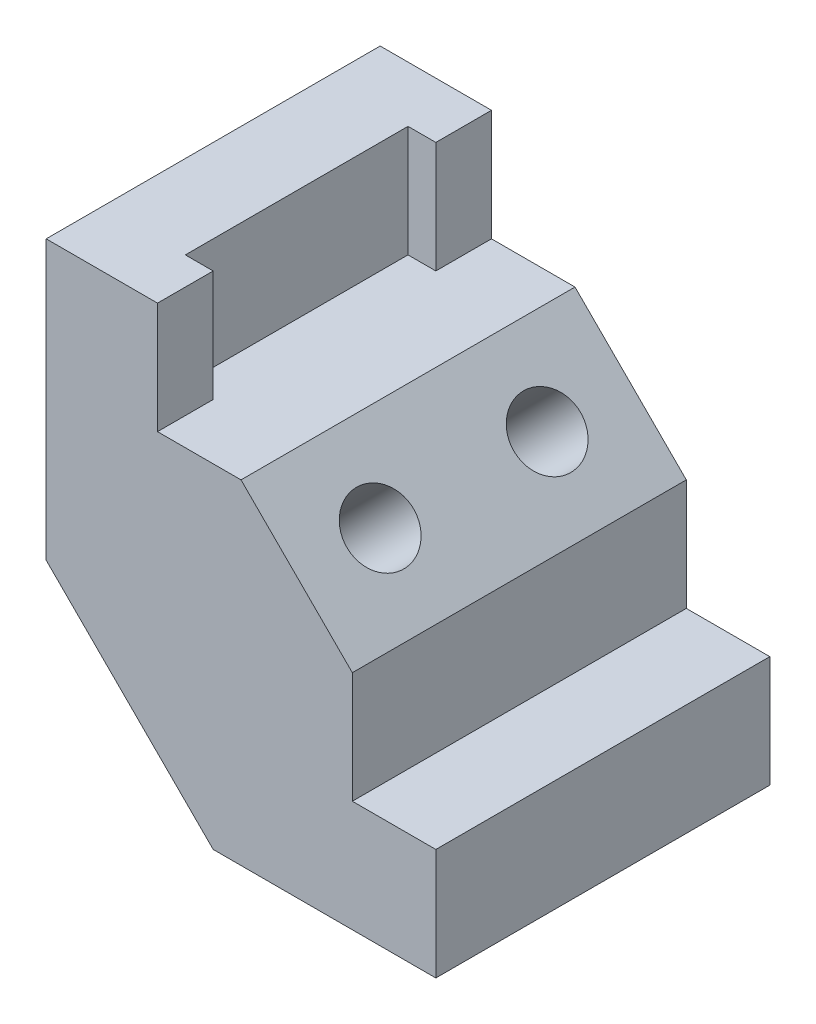
ISO-10303-21;
HEADER;
FILE_DESCRIPTION(('STEP AP214'),'2;1');
FILE_NAME('part.step','',(''),(''),'','','');
FILE_SCHEMA(('AUTOMOTIVE_DESIGN { 1 0 10303 214 1 1 1 1 }'));
ENDSEC;
DATA;
#1=APPLICATION_CONTEXT('core data for automotive mechanical design processes');
#2=APPLICATION_PROTOCOL_DEFINITION('international standard','automotive_design',2000,#1);
#3=PRODUCT_CONTEXT('',#1,'mechanical');
#4=PRODUCT('Part','Part','',(#3));
#5=PRODUCT_RELATED_PRODUCT_CATEGORY('part','',(#4));
#6=PRODUCT_DEFINITION_FORMATION('','',#4);
#7=PRODUCT_DEFINITION_CONTEXT('part definition',#1,'design');
#8=PRODUCT_DEFINITION('design','',#6,#7);
#9=PRODUCT_DEFINITION_SHAPE('','',#8);
#10=(LENGTH_UNIT() NAMED_UNIT(*) SI_UNIT(.MILLI.,.METRE.));
#11=(NAMED_UNIT(*) PLANE_ANGLE_UNIT() SI_UNIT($,.RADIAN.));
#12=(NAMED_UNIT(*) SI_UNIT($,.STERADIAN.) SOLID_ANGLE_UNIT());
#13=UNCERTAINTY_MEASURE_WITH_UNIT(LENGTH_MEASURE(1.E-05),#10,'distance_accuracy_value','');
#14=(GEOMETRIC_REPRESENTATION_CONTEXT(3) GLOBAL_UNCERTAINTY_ASSIGNED_CONTEXT((#13)) GLOBAL_UNIT_ASSIGNED_CONTEXT((#10,
#11,#12)) REPRESENTATION_CONTEXT('',''));
#15=CARTESIAN_POINT('',(0.,0.,0.));
#16=DIRECTION('',(0.,0.,1.));
#17=DIRECTION('',(1.,0.,0.));
#18=AXIS2_PLACEMENT_3D('',#15,#16,#17);
#19=CARTESIAN_POINT('',(25.4,-7.00371083234736,38.1));
#20=DIRECTION('',(-1.,0.,0.));
#21=DIRECTION('',(0.,0.,1.));
#22=AXIS2_PLACEMENT_3D('',#19,#20,#21);
#23=PLANE('',#22);
#24=DIRECTION('',(0.,0.,-1.));
#25=VECTOR('',#24,1.);
#26=CARTESIAN_POINT('',(25.4,-7.00371083234736,38.1));
#27=LINE('',#26,#25);
#28=CARTESIAN_POINT('',(25.4,-7.00371083234736,38.1));
#29=VERTEX_POINT('',#28);
#30=CARTESIAN_POINT('',(25.4,-7.00371083234735,25.4));
#31=VERTEX_POINT('',#30);
#32=EDGE_CURVE('E154',#29,#31,#27,.T.);
#33=ORIENTED_EDGE('',*,*,#32,.T.);
#34=DIRECTION('',(0.,1.,0.));
#35=VECTOR('',#34,1.);
#36=CARTESIAN_POINT('',(25.4,-58.1990475340431,25.4));
#37=LINE('',#36,#35);
#38=CARTESIAN_POINT('',(25.4,18.3962891676527,25.4));
#39=VERTEX_POINT('',#38);
#40=EDGE_CURVE('E236',#31,#39,#37,.T.);
#41=ORIENTED_EDGE('',*,*,#40,.T.);
#42=DIRECTION('',(0.,0.,-1.));
#43=VECTOR('',#42,1.);
#44=CARTESIAN_POINT('',(25.4,18.3962891676527,38.1));
#45=LINE('',#44,#43);
#46=CARTESIAN_POINT('',(25.4,18.3962891676527,38.1));
#47=VERTEX_POINT('',#46);
#48=EDGE_CURVE('E184',#47,#39,#45,.T.);
#49=ORIENTED_EDGE('',*,*,#48,.F.);
#50=DIRECTION('',(0.,1.,0.));
#51=VECTOR('',#50,1.);
#52=CARTESIAN_POINT('',(25.4,-7.00371083234736,38.1));
#53=LINE('',#52,#51);
#54=EDGE_CURVE('E63',#29,#47,#53,.T.);
#55=ORIENTED_EDGE('',*,*,#54,.F.);
#56=EDGE_LOOP('',(#33,#41,#49,#55));
#57=FACE_BOUND('',#56,.T.);
#58=ADVANCED_FACE('F39',(#57),#23,.F.);
#59=CARTESIAN_POINT('',(25.4,18.3962891676527,38.1));
#60=DIRECTION('',(0.,-1.,0.));
#61=DIRECTION('',(1.,0.,0.));
#62=AXIS2_PLACEMENT_3D('',#59,#60,#61);
#63=PLANE('',#62);
#64=ORIENTED_EDGE('',*,*,#48,.T.);
#65=DIRECTION('',(1.,0.,0.));
#66=VECTOR('',#65,1.);
#67=CARTESIAN_POINT('',(25.4,18.3962891676527,25.4));
#68=LINE('',#67,#66);
#69=CARTESIAN_POINT('',(19.05,18.3962891676527,25.4));
#70=VERTEX_POINT('',#69);
#71=EDGE_CURVE('E253',#70,#39,#68,.T.);
#72=ORIENTED_EDGE('',*,*,#71,.F.);
#73=DIRECTION('',(0.,0.,1.));
#74=VECTOR('',#73,1.);
#75=CARTESIAN_POINT('',(19.05,18.3962891676527,25.4));
#76=LINE('',#75,#74);
#77=CARTESIAN_POINT('',(19.05,18.3962891676527,-25.4));
#78=VERTEX_POINT('',#77);
#79=EDGE_CURVE('E250',#78,#70,#76,.T.);
#80=ORIENTED_EDGE('',*,*,#79,.F.);
#81=DIRECTION('',(-1.,0.,0.));
#82=VECTOR('',#81,1.);
#83=CARTESIAN_POINT('',(25.4,18.3962891676527,-25.4));
#84=LINE('',#83,#82);
#85=CARTESIAN_POINT('',(25.4,18.3962891676527,-25.4));
#86=VERTEX_POINT('',#85);
#87=EDGE_CURVE('E249',#86,#78,#84,.T.);
#88=ORIENTED_EDGE('',*,*,#87,.F.);
#89=CARTESIAN_POINT('',(25.4,18.3962891676527,-38.1));
#90=VERTEX_POINT('',#89);
#91=EDGE_CURVE('E103',#86,#90,#45,.T.);
#92=ORIENTED_EDGE('',*,*,#91,.T.);
#93=DIRECTION('',(-1.,0.,0.));
#94=VECTOR('',#93,1.);
#95=CARTESIAN_POINT('',(25.4,18.3962891676527,-38.1));
#96=LINE('',#95,#94);
#97=CARTESIAN_POINT('',(0.,18.3962891676526,-38.1));
#98=VERTEX_POINT('',#97);
#99=EDGE_CURVE('E163',#90,#98,#96,.T.);
#100=ORIENTED_EDGE('',*,*,#99,.T.);
#101=DIRECTION('',(0.,0.,-1.));
#102=VECTOR('',#101,1.);
#103=CARTESIAN_POINT('',(0.,18.3962891676526,38.1));
#104=LINE('',#103,#102);
#105=CARTESIAN_POINT('',(0.,18.3962891676526,38.1));
#106=VERTEX_POINT('',#105);
#107=EDGE_CURVE('E11',#106,#98,#104,.T.);
#108=ORIENTED_EDGE('',*,*,#107,.F.);
#109=DIRECTION('',(-1.,0.,0.));
#110=VECTOR('',#109,1.);
#111=CARTESIAN_POINT('',(25.4,18.3962891676527,38.1));
#112=LINE('',#111,#110);
#113=EDGE_CURVE('E183',#47,#106,#112,.T.);
#114=ORIENTED_EDGE('',*,*,#113,.F.);
#115=EDGE_LOOP('',(#64,#72,#80,#88,#92,#100,#108,#114));
#116=FACE_BOUND('',#115,.T.);
#117=ADVANCED_FACE('F41',(#116),#63,.F.);
#118=CARTESIAN_POINT('',(0.,18.3962891676526,38.1));
#119=DIRECTION('',(1.,0.,0.));
#120=DIRECTION('',(0.,0.,-1.));
#121=AXIS2_PLACEMENT_3D('',#118,#119,#120);
#122=PLANE('',#121);
#123=DIRECTION('',(0.,-1.,0.));
#124=VECTOR('',#123,1.);
#125=CARTESIAN_POINT('',(0.,18.3962891676526,-38.1));
#126=LINE('',#125,#124);
#127=CARTESIAN_POINT('',(0.,-45.1037108323472,-38.1));
#128=VERTEX_POINT('',#127);
#129=EDGE_CURVE('E165',#98,#128,#126,.T.);
#130=ORIENTED_EDGE('',*,*,#129,.T.);
#131=DIRECTION('',(0.,0.,-1.));
#132=VECTOR('',#131,1.);
#133=CARTESIAN_POINT('',(0.,-45.1037108323472,38.1));
#134=LINE('',#133,#132);
#135=CARTESIAN_POINT('',(0.,-45.1037108323472,38.1));
#136=VERTEX_POINT('',#135);
#137=EDGE_CURVE('E47',#136,#128,#134,.T.);
#138=ORIENTED_EDGE('',*,*,#137,.F.);
#139=DIRECTION('',(0.,-1.,0.));
#140=VECTOR('',#139,1.);
#141=CARTESIAN_POINT('',(0.,18.3962891676526,38.1));
#142=LINE('',#141,#140);
#143=EDGE_CURVE('E111',#106,#136,#142,.T.);
#144=ORIENTED_EDGE('',*,*,#143,.F.);
#145=ORIENTED_EDGE('',*,*,#107,.T.);
#146=EDGE_LOOP('',(#130,#138,#144,#145));
#147=FACE_BOUND('',#146,.T.);
#148=ADVANCED_FACE('F309',(#147),#122,.F.);
#149=CARTESIAN_POINT('',(0.,-45.1037108323472,38.1));
#150=DIRECTION('',(0.707106781186549,0.707106781186546,0.));
#151=DIRECTION('',(-0.707106781186546,0.707106781186549,0.));
#152=AXIS2_PLACEMENT_3D('',#149,#150,#151);
#153=PLANE('',#152);
#154=DIRECTION('',(0.707106781186546,-0.707106781186549,0.));
#155=VECTOR('',#154,1.);
#156=CARTESIAN_POINT('',(0.,-45.1037108323472,-38.1));
#157=LINE('',#156,#155);
#158=CARTESIAN_POINT('',(38.1,-83.2037108323474,-38.1));
#159=VERTEX_POINT('',#158);
#160=EDGE_CURVE('E168',#128,#159,#157,.T.);
#161=ORIENTED_EDGE('',*,*,#160,.T.);
#162=DIRECTION('',(0.,0.,-1.));
#163=VECTOR('',#162,1.);
#164=CARTESIAN_POINT('',(38.1,-83.2037108323474,38.1));
#165=LINE('',#164,#163);
#166=CARTESIAN_POINT('',(38.1,-83.2037108323474,38.1));
#167=VERTEX_POINT('',#166);
#168=EDGE_CURVE('E199',#167,#159,#165,.T.);
#169=ORIENTED_EDGE('',*,*,#168,.F.);
#170=DIRECTION('',(0.707106781186546,-0.707106781186549,0.));
#171=VECTOR('',#170,1.);
#172=CARTESIAN_POINT('',(0.,-45.1037108323472,38.1));
#173=LINE('',#172,#171);
#174=EDGE_CURVE('E207',#136,#167,#173,.T.);
#175=ORIENTED_EDGE('',*,*,#174,.F.);
#176=ORIENTED_EDGE('',*,*,#137,.T.);
#177=EDGE_LOOP('',(#161,#169,#175,#176));
#178=FACE_BOUND('',#177,.T.);
#179=ADVANCED_FACE('F205',(#178),#153,.F.);
#180=CARTESIAN_POINT('',(38.1,-83.2037108323474,38.1));
#181=DIRECTION('',(0.,1.,0.));
#182=DIRECTION('',(-1.,0.,0.));
#183=AXIS2_PLACEMENT_3D('',#180,#181,#182);
#184=PLANE('',#183);
#185=DIRECTION('',(1.,0.,0.));
#186=VECTOR('',#185,1.);
#187=CARTESIAN_POINT('',(38.1,-83.2037108323474,-38.1));
#188=LINE('',#187,#186);
#189=CARTESIAN_POINT('',(88.9,-83.2037108323474,-38.1));
#190=VERTEX_POINT('',#189);
#191=EDGE_CURVE('E170',#159,#190,#188,.T.);
#192=ORIENTED_EDGE('',*,*,#191,.T.);
#193=DIRECTION('',(0.,0.,-1.));
#194=VECTOR('',#193,1.);
#195=CARTESIAN_POINT('',(88.9,-83.2037108323474,38.1));
#196=LINE('',#195,#194);
#197=CARTESIAN_POINT('',(88.9,-83.2037108323474,38.1));
#198=VERTEX_POINT('',#197);
#199=EDGE_CURVE('E196',#198,#190,#196,.T.);
#200=ORIENTED_EDGE('',*,*,#199,.F.);
#201=DIRECTION('',(1.,0.,0.));
#202=VECTOR('',#201,1.);
#203=CARTESIAN_POINT('',(38.1,-83.2037108323474,38.1));
#204=LINE('',#203,#202);
#205=EDGE_CURVE('E225',#167,#198,#204,.T.);
#206=ORIENTED_EDGE('',*,*,#205,.F.);
#207=ORIENTED_EDGE('',*,*,#168,.T.);
#208=EDGE_LOOP('',(#192,#200,#206,#207));
#209=FACE_BOUND('',#208,.T.);
#210=ADVANCED_FACE('F216',(#209),#184,.F.);
#211=CARTESIAN_POINT('',(88.9,-83.2037108323474,38.1));
#212=DIRECTION('',(-1.,0.,0.));
#213=DIRECTION('',(0.,0.,1.));
#214=AXIS2_PLACEMENT_3D('',#211,#212,#213);
#215=PLANE('',#214);
#216=DIRECTION('',(0.,1.,0.));
#217=VECTOR('',#216,1.);
#218=CARTESIAN_POINT('',(88.9,-83.2037108323474,-38.1));
#219=LINE('',#218,#217);
#220=CARTESIAN_POINT('',(88.9,-57.8037108323474,-38.1));
#221=VERTEX_POINT('',#220);
#222=EDGE_CURVE('E172',#190,#221,#219,.T.);
#223=ORIENTED_EDGE('',*,*,#222,.T.);
#224=DIRECTION('',(0.,0.,-1.));
#225=VECTOR('',#224,1.);
#226=CARTESIAN_POINT('',(88.9,-57.8037108323474,38.1));
#227=LINE('',#226,#225);
#228=CARTESIAN_POINT('',(88.9,-57.8037108323474,38.1));
#229=VERTEX_POINT('',#228);
#230=EDGE_CURVE('E193',#229,#221,#227,.T.);
#231=ORIENTED_EDGE('',*,*,#230,.F.);
#232=DIRECTION('',(0.,1.,0.));
#233=VECTOR('',#232,1.);
#234=CARTESIAN_POINT('',(88.9,-83.2037108323474,38.1));
#235=LINE('',#234,#233);
#236=EDGE_CURVE('E222',#198,#229,#235,.T.);
#237=ORIENTED_EDGE('',*,*,#236,.F.);
#238=ORIENTED_EDGE('',*,*,#199,.T.);
#239=EDGE_LOOP('',(#223,#231,#237,#238));
#240=FACE_BOUND('',#239,.T.);
#241=ADVANCED_FACE('F220',(#240),#215,.F.);
#242=CARTESIAN_POINT('',(88.9,-57.8037108323474,38.1));
#243=DIRECTION('',(0.,-1.,0.));
#244=DIRECTION('',(1.,0.,0.));
#245=AXIS2_PLACEMENT_3D('',#242,#243,#244);
#246=PLANE('',#245);
#247=DIRECTION('',(-1.,0.,0.));
#248=VECTOR('',#247,1.);
#249=CARTESIAN_POINT('',(88.9,-57.8037108323474,-38.1));
#250=LINE('',#249,#248);
#251=CARTESIAN_POINT('',(69.8499999999999,-57.8037108323473,-38.1));
#252=VERTEX_POINT('',#251);
#253=EDGE_CURVE('E174',#221,#252,#250,.T.);
#254=ORIENTED_EDGE('',*,*,#253,.T.);
#255=DIRECTION('',(0.,0.,-1.));
#256=VECTOR('',#255,1.);
#257=CARTESIAN_POINT('',(69.8499999999999,-57.8037108323473,38.1));
#258=LINE('',#257,#256);
#259=CARTESIAN_POINT('',(69.8499999999999,-57.8037108323473,38.1));
#260=VERTEX_POINT('',#259);
#261=EDGE_CURVE('E190',#260,#252,#258,.T.);
#262=ORIENTED_EDGE('',*,*,#261,.F.);
#263=DIRECTION('',(-1.,0.,0.));
#264=VECTOR('',#263,1.);
#265=CARTESIAN_POINT('',(88.9,-57.8037108323474,38.1));
#266=LINE('',#265,#264);
#267=EDGE_CURVE('E224',#229,#260,#266,.T.);
#268=ORIENTED_EDGE('',*,*,#267,.F.);
#269=ORIENTED_EDGE('',*,*,#230,.T.);
#270=EDGE_LOOP('',(#254,#262,#268,#269));
#271=FACE_BOUND('',#270,.T.);
#272=ADVANCED_FACE('F352',(#271),#246,.F.);
#273=CARTESIAN_POINT('',(69.8499999999999,-57.8037108323473,38.1));
#274=DIRECTION('',(-1.,0.,0.));
#275=DIRECTION('',(0.,-1.,0.));
#276=AXIS2_PLACEMENT_3D('',#273,#274,#275);
#277=PLANE('',#276);
#278=DIRECTION('',(0.,1.,0.));
#279=VECTOR('',#278,1.);
#280=CARTESIAN_POINT('',(69.8499999999999,-57.8037108323473,-38.1));
#281=LINE('',#280,#279);
#282=CARTESIAN_POINT('',(69.8499999999999,-32.4037108323473,-38.1));
#283=VERTEX_POINT('',#282);
#284=EDGE_CURVE('E176',#252,#283,#281,.T.);
#285=ORIENTED_EDGE('',*,*,#284,.T.);
#286=DIRECTION('',(0.,0.,-1.));
#287=VECTOR('',#286,1.);
#288=CARTESIAN_POINT('',(69.8499999999999,-32.4037108323473,38.1));
#289=LINE('',#288,#287);
#290=CARTESIAN_POINT('',(69.8499999999999,-32.4037108323473,38.1));
#291=VERTEX_POINT('',#290);
#292=EDGE_CURVE('E153',#291,#283,#289,.T.);
#293=ORIENTED_EDGE('',*,*,#292,.F.);
#294=DIRECTION('',(0.,1.,0.));
#295=VECTOR('',#294,1.);
#296=CARTESIAN_POINT('',(69.8499999999999,-57.8037108323473,38.1));
#297=LINE('',#296,#295);
#298=EDGE_CURVE('E140',#260,#291,#297,.T.);
#299=ORIENTED_EDGE('',*,*,#298,.F.);
#300=ORIENTED_EDGE('',*,*,#261,.T.);
#301=EDGE_LOOP('',(#285,#293,#299,#300));
#302=FACE_BOUND('',#301,.T.);
#303=ADVANCED_FACE('F282',(#302),#277,.F.);
#304=CARTESIAN_POINT('',(69.8499999999999,-32.4037108323473,38.1));
#305=DIRECTION('',(-0.707106781186549,-0.707106781186546,0.));
#306=DIRECTION('',(0.707106781186546,-0.707106781186549,0.));
#307=AXIS2_PLACEMENT_3D('',#304,#305,#306);
#308=PLANE('',#307);
#309=CARTESIAN_POINT('',(57.1519178448082,-19.7056286771556,19.05));
#310=DIRECTION('',(0.707106781186549,0.707106781186547,0.));
#311=DIRECTION('',(-0.707106781186546,0.707106781186549,0.));
#312=AXIS2_PLACEMENT_3D('',#309,#310,#311);
#313=CIRCLE('',#312,7.62);
#314=CARTESIAN_POINT('',(51.7637641721667,-14.3174750045141,19.05));
#315=VERTEX_POINT('',#314);
#316=EDGE_CURVE('E265',#315,#315,#313,.T.);
#317=ORIENTED_EDGE('',*,*,#316,.F.);
#318=EDGE_LOOP('',(#317));
#319=FACE_BOUND('',#318,.T.);
#320=CARTESIAN_POINT('',(57.1519178448082,-19.7056286771556,-19.05));
#321=DIRECTION('',(0.707106781186549,0.707106781186547,0.));
#322=DIRECTION('',(-0.707106781186546,0.707106781186549,0.));
#323=AXIS2_PLACEMENT_3D('',#320,#321,#322);
#324=CIRCLE('',#323,7.62);
#325=CARTESIAN_POINT('',(51.7637641721667,-14.3174750045141,-19.05));
#326=VERTEX_POINT('',#325);
#327=EDGE_CURVE('E259',#326,#326,#324,.T.);
#328=ORIENTED_EDGE('',*,*,#327,.F.);
#329=EDGE_LOOP('',(#328));
#330=FACE_BOUND('',#329,.T.);
#331=DIRECTION('',(-0.707106781186546,0.707106781186549,0.));
#332=VECTOR('',#331,1.);
#333=CARTESIAN_POINT('',(69.8499999999999,-32.4037108323473,-38.1));
#334=LINE('',#333,#332);
#335=CARTESIAN_POINT('',(44.45,-7.00371083234735,-38.1));
#336=VERTEX_POINT('',#335);
#337=EDGE_CURVE('E149',#283,#336,#334,.T.);
#338=ORIENTED_EDGE('',*,*,#337,.T.);
#339=DIRECTION('',(0.,0.,-1.));
#340=VECTOR('',#339,1.);
#341=CARTESIAN_POINT('',(44.45,-7.00371083234735,38.1));
#342=LINE('',#341,#340);
#343=CARTESIAN_POINT('',(44.45,-7.00371083234735,38.1));
#344=VERTEX_POINT('',#343);
#345=EDGE_CURVE('E146',#344,#336,#342,.T.);
#346=ORIENTED_EDGE('',*,*,#345,.F.);
#347=DIRECTION('',(-0.707106781186546,0.707106781186549,0.));
#348=VECTOR('',#347,1.);
#349=CARTESIAN_POINT('',(69.8499999999999,-32.4037108323473,38.1));
#350=LINE('',#349,#348);
#351=EDGE_CURVE('E133',#291,#344,#350,.T.);
#352=ORIENTED_EDGE('',*,*,#351,.F.);
#353=ORIENTED_EDGE('',*,*,#292,.T.);
#354=EDGE_LOOP('',(#338,#346,#352,#353));
#355=FACE_BOUND('',#354,.T.);
#356=ADVANCED_FACE('F147',(#319,#330,#355),#308,.F.);
#357=CARTESIAN_POINT('',(44.45,-7.00371083234735,38.1));
#358=DIRECTION('',(0.,-1.,0.));
#359=DIRECTION('',(1.,0.,0.));
#360=AXIS2_PLACEMENT_3D('',#357,#358,#359);
#361=PLANE('',#360);
#362=DIRECTION('',(-1.,0.,0.));
#363=VECTOR('',#362,1.);
#364=CARTESIAN_POINT('',(44.45,-7.00371083234735,-38.1));
#365=LINE('',#364,#363);
#366=CARTESIAN_POINT('',(25.4,-7.00371083234736,-38.1));
#367=VERTEX_POINT('',#366);
#368=EDGE_CURVE('E179',#336,#367,#365,.T.);
#369=ORIENTED_EDGE('',*,*,#368,.T.);
#370=CARTESIAN_POINT('',(25.4,-7.00371083234736,-25.4));
#371=VERTEX_POINT('',#370);
#372=EDGE_CURVE('E187',#371,#367,#27,.T.);
#373=ORIENTED_EDGE('',*,*,#372,.F.);
#374=DIRECTION('',(-1.,0.,0.));
#375=VECTOR('',#374,1.);
#376=CARTESIAN_POINT('',(25.4,-7.00371083234735,-25.4));
#377=LINE('',#376,#375);
#378=CARTESIAN_POINT('',(19.05,-7.00371083234735,-25.4));
#379=VERTEX_POINT('',#378);
#380=EDGE_CURVE('E54',#371,#379,#377,.T.);
#381=ORIENTED_EDGE('',*,*,#380,.T.);
#382=DIRECTION('',(0.,0.,1.));
#383=VECTOR('',#382,1.);
#384=CARTESIAN_POINT('',(19.05,-7.00371083234735,25.4));
#385=LINE('',#384,#383);
#386=CARTESIAN_POINT('',(19.05,-7.00371083234735,25.4));
#387=VERTEX_POINT('',#386);
#388=EDGE_CURVE('E235',#379,#387,#385,.T.);
#389=ORIENTED_EDGE('',*,*,#388,.T.);
#390=DIRECTION('',(1.,0.,0.));
#391=VECTOR('',#390,1.);
#392=CARTESIAN_POINT('',(25.4,-7.00371083234735,25.4));
#393=LINE('',#392,#391);
#394=EDGE_CURVE('E240',#387,#31,#393,.T.);
#395=ORIENTED_EDGE('',*,*,#394,.T.);
#396=ORIENTED_EDGE('',*,*,#32,.F.);
#397=DIRECTION('',(-1.,0.,0.));
#398=VECTOR('',#397,1.);
#399=CARTESIAN_POINT('',(44.45,-7.00371083234735,38.1));
#400=LINE('',#399,#398);
#401=EDGE_CURVE('E137',#344,#29,#400,.T.);
#402=ORIENTED_EDGE('',*,*,#401,.F.);
#403=ORIENTED_EDGE('',*,*,#345,.T.);
#404=EDGE_LOOP('',(#369,#373,#381,#389,#395,#396,#402,#403));
#405=FACE_BOUND('',#404,.T.);
#406=ADVANCED_FACE('F156',(#405),#361,.F.);
#407=ORIENTED_EDGE('',*,*,#91,.F.);
#408=DIRECTION('',(0.,1.,0.));
#409=VECTOR('',#408,1.);
#410=CARTESIAN_POINT('',(25.4,-58.1990475340431,-25.4));
#411=LINE('',#410,#409);
#412=EDGE_CURVE('E239',#371,#86,#411,.T.);
#413=ORIENTED_EDGE('',*,*,#412,.F.);
#414=ORIENTED_EDGE('',*,*,#372,.T.);
#415=DIRECTION('',(0.,1.,0.));
#416=VECTOR('',#415,1.);
#417=CARTESIAN_POINT('',(25.4,-7.00371083234736,-38.1));
#418=LINE('',#417,#416);
#419=EDGE_CURVE('E181',#367,#90,#418,.T.);
#420=ORIENTED_EDGE('',*,*,#419,.T.);
#421=EDGE_LOOP('',(#407,#413,#414,#420));
#422=FACE_BOUND('',#421,.T.);
#423=ADVANCED_FACE('F304',(#422),#23,.F.);
#424=CARTESIAN_POINT('',(0.,0.,38.1));
#425=DIRECTION('',(0.,0.,1.));
#426=DIRECTION('',(1.,0.,0.));
#427=AXIS2_PLACEMENT_3D('',#424,#425,#426);
#428=PLANE('',#427);
#429=ORIENTED_EDGE('',*,*,#113,.T.);
#430=ORIENTED_EDGE('',*,*,#143,.T.);
#431=ORIENTED_EDGE('',*,*,#174,.T.);
#432=ORIENTED_EDGE('',*,*,#205,.T.);
#433=ORIENTED_EDGE('',*,*,#236,.T.);
#434=ORIENTED_EDGE('',*,*,#267,.T.);
#435=ORIENTED_EDGE('',*,*,#298,.T.);
#436=ORIENTED_EDGE('',*,*,#351,.T.);
#437=ORIENTED_EDGE('',*,*,#401,.T.);
#438=ORIENTED_EDGE('',*,*,#54,.T.);
#439=EDGE_LOOP('',(#429,#430,#431,#432,#433,#434,#435,#436,#437,#438));
#440=FACE_BOUND('',#439,.T.);
#441=ADVANCED_FACE('F135',(#440),#428,.T.);
#442=CARTESIAN_POINT('',(0.,0.,-38.1));
#443=DIRECTION('',(0.,0.,1.));
#444=DIRECTION('',(1.,0.,0.));
#445=AXIS2_PLACEMENT_3D('',#442,#443,#444);
#446=PLANE('',#445);
#447=ORIENTED_EDGE('',*,*,#99,.F.);
#448=ORIENTED_EDGE('',*,*,#419,.F.);
#449=ORIENTED_EDGE('',*,*,#368,.F.);
#450=ORIENTED_EDGE('',*,*,#337,.F.);
#451=ORIENTED_EDGE('',*,*,#284,.F.);
#452=ORIENTED_EDGE('',*,*,#253,.F.);
#453=ORIENTED_EDGE('',*,*,#222,.F.);
#454=ORIENTED_EDGE('',*,*,#191,.F.);
#455=ORIENTED_EDGE('',*,*,#160,.F.);
#456=ORIENTED_EDGE('',*,*,#129,.F.);
#457=EDGE_LOOP('',(#447,#448,#449,#450,#451,#452,#453,#454,#455,#456));
#458=FACE_BOUND('',#457,.T.);
#459=ADVANCED_FACE('F211',(#458),#446,.F.);
#460=CARTESIAN_POINT('',(25.4,-58.1990475340431,25.4));
#461=DIRECTION('',(0.,0.,1.));
#462=DIRECTION('',(1.,0.,0.));
#463=AXIS2_PLACEMENT_3D('',#460,#461,#462);
#464=PLANE('',#463);
#465=DIRECTION('',(0.,1.,0.));
#466=VECTOR('',#465,1.);
#467=CARTESIAN_POINT('',(19.05,-58.1990475340431,25.4));
#468=LINE('',#467,#466);
#469=EDGE_CURVE('E166',#387,#70,#468,.T.);
#470=ORIENTED_EDGE('',*,*,#469,.T.);
#471=ORIENTED_EDGE('',*,*,#71,.T.);
#472=ORIENTED_EDGE('',*,*,#40,.F.);
#473=ORIENTED_EDGE('',*,*,#394,.F.);
#474=EDGE_LOOP('',(#470,#471,#472,#473));
#475=FACE_BOUND('',#474,.T.);
#476=ADVANCED_FACE('F337',(#475),#464,.F.);
#477=CARTESIAN_POINT('',(25.4,-58.1990475340431,-25.4));
#478=DIRECTION('',(0.,0.,-1.));
#479=DIRECTION('',(-1.,0.,0.));
#480=AXIS2_PLACEMENT_3D('',#477,#478,#479);
#481=PLANE('',#480);
#482=ORIENTED_EDGE('',*,*,#412,.T.);
#483=ORIENTED_EDGE('',*,*,#87,.T.);
#484=DIRECTION('',(0.,1.,0.));
#485=VECTOR('',#484,1.);
#486=CARTESIAN_POINT('',(19.05,-58.1990475340431,-25.4));
#487=LINE('',#486,#485);
#488=EDGE_CURVE('E242',#379,#78,#487,.T.);
#489=ORIENTED_EDGE('',*,*,#488,.F.);
#490=ORIENTED_EDGE('',*,*,#380,.F.);
#491=EDGE_LOOP('',(#482,#483,#489,#490));
#492=FACE_BOUND('',#491,.T.);
#493=ADVANCED_FACE('F297',(#492),#481,.F.);
#494=CARTESIAN_POINT('',(19.05,-58.1990475340431,25.4));
#495=DIRECTION('',(-1.,0.,0.));
#496=DIRECTION('',(0.,-1.,0.));
#497=AXIS2_PLACEMENT_3D('',#494,#495,#496);
#498=PLANE('',#497);
#499=ORIENTED_EDGE('',*,*,#488,.T.);
#500=ORIENTED_EDGE('',*,*,#79,.T.);
#501=ORIENTED_EDGE('',*,*,#469,.F.);
#502=ORIENTED_EDGE('',*,*,#388,.F.);
#503=EDGE_LOOP('',(#499,#500,#501,#502));
#504=FACE_BOUND('',#503,.T.);
#505=ADVANCED_FACE('F288',(#504),#498,.F.);
#506=CARTESIAN_POINT('',(19.4348421363176,-57.4227043856459,-19.05));
#507=DIRECTION('',(0.707106781186549,0.707106781186546,0.));
#508=DIRECTION('',(-0.707106781186546,0.707106781186549,0.));
#509=AXIS2_PLACEMENT_3D('',#506,#507,#508);
#510=CYLINDRICAL_SURFACE('',#509,7.62);
#511=CARTESIAN_POINT('',(19.4348421363176,-57.4227043856459,-19.05));
#512=DIRECTION('',(0.707106781186549,0.707106781186547,0.));
#513=DIRECTION('',(-0.707106781186546,0.707106781186549,0.));
#514=AXIS2_PLACEMENT_3D('',#511,#512,#513);
#515=CIRCLE('',#514,7.62);
#516=CARTESIAN_POINT('',(14.0466884636762,-52.0345507130044,-19.05));
#517=VERTEX_POINT('',#516);
#518=EDGE_CURVE('E262',#517,#517,#515,.T.);
#519=ORIENTED_EDGE('',*,*,#518,.F.);
#520=EDGE_LOOP('',(#519));
#521=FACE_BOUND('',#520,.T.);
#522=ORIENTED_EDGE('',*,*,#327,.T.);
#523=EDGE_LOOP('',(#522));
#524=FACE_BOUND('',#523,.T.);
#525=ADVANCED_FACE('F286',(#521,#524),#510,.F.);
#526=CARTESIAN_POINT('',(-18.9939311246641,-18.993931124664,0.));
#527=DIRECTION('',(0.707106781186549,0.707106781186547,0.));
#528=DIRECTION('',(-0.707106781186546,0.707106781186549,0.));
#529=AXIS2_PLACEMENT_3D('',#526,#527,#528);
#530=PLANE('',#529);
#531=ORIENTED_EDGE('',*,*,#518,.T.);
#532=EDGE_LOOP('',(#531));
#533=FACE_BOUND('',#532,.T.);
#534=ADVANCED_FACE('F276',(#533),#530,.T.);
#535=CARTESIAN_POINT('',(19.4348421363176,-57.4227043856459,19.05));
#536=DIRECTION('',(0.707106781186549,0.707106781186546,0.));
#537=DIRECTION('',(-0.707106781186546,0.707106781186549,0.));
#538=AXIS2_PLACEMENT_3D('',#535,#536,#537);
#539=CYLINDRICAL_SURFACE('',#538,7.62);
#540=CARTESIAN_POINT('',(19.4348421363176,-57.4227043856459,19.05));
#541=DIRECTION('',(0.707106781186549,0.707106781186547,0.));
#542=DIRECTION('',(-0.707106781186546,0.707106781186549,0.));
#543=AXIS2_PLACEMENT_3D('',#540,#541,#542);
#544=CIRCLE('',#543,7.62);
#545=CARTESIAN_POINT('',(14.0466884636762,-52.0345507130044,19.05));
#546=VERTEX_POINT('',#545);
#547=EDGE_CURVE('E254',#546,#546,#544,.T.);
#548=ORIENTED_EDGE('',*,*,#547,.F.);
#549=EDGE_LOOP('',(#548));
#550=FACE_BOUND('',#549,.T.);
#551=ORIENTED_EDGE('',*,*,#316,.T.);
#552=EDGE_LOOP('',(#551));
#553=FACE_BOUND('',#552,.T.);
#554=ADVANCED_FACE('F273',(#550,#553),#539,.F.);
#555=CARTESIAN_POINT('',(-18.9939311246641,-18.993931124664,0.));
#556=DIRECTION('',(0.707106781186549,0.707106781186547,0.));
#557=DIRECTION('',(-0.707106781186546,0.707106781186549,0.));
#558=AXIS2_PLACEMENT_3D('',#555,#556,#557);
#559=PLANE('',#558);
#560=ORIENTED_EDGE('',*,*,#547,.T.);
#561=EDGE_LOOP('',(#560));
#562=FACE_BOUND('',#561,.T.);
#563=ADVANCED_FACE('F271',(#562),#559,.T.);
#564=CLOSED_SHELL('',(#58,#117,#148,#179,#210,#241,#272,#303,#356,#406,#423,#441,#459,#476,#493,
#505,#525,#534,#554,#563));
#565=MANIFOLD_SOLID_BREP('B2',#564);
#566=ADVANCED_BREP_SHAPE_REPRESENTATION('',(#18,#565),#14);
#567=SHAPE_DEFINITION_REPRESENTATION(#9,#566);
ENDSEC;
END-ISO-10303-21;
